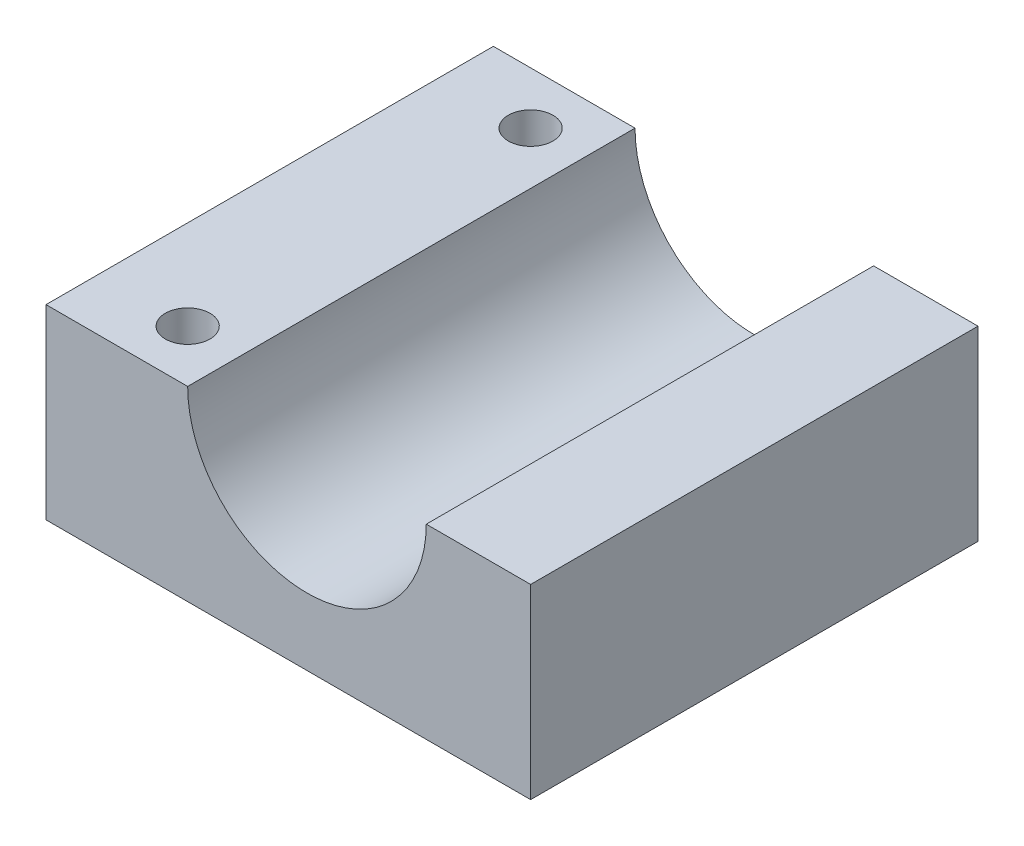
ISO-10303-21;
HEADER;
FILE_DESCRIPTION(('STEP AP214'),'2;1');
FILE_NAME('part.step','',(''),(''),'','','');
FILE_SCHEMA(('AUTOMOTIVE_DESIGN { 1 0 10303 214 1 1 1 1 }'));
ENDSEC;
DATA;
#1=APPLICATION_CONTEXT('core data for automotive mechanical design processes');
#2=APPLICATION_PROTOCOL_DEFINITION('international standard','automotive_design',2000,#1);
#3=PRODUCT_CONTEXT('',#1,'mechanical');
#4=PRODUCT('Part','Part','',(#3));
#5=PRODUCT_RELATED_PRODUCT_CATEGORY('part','',(#4));
#6=PRODUCT_DEFINITION_FORMATION('','',#4);
#7=PRODUCT_DEFINITION_CONTEXT('part definition',#1,'design');
#8=PRODUCT_DEFINITION('design','',#6,#7);
#9=PRODUCT_DEFINITION_SHAPE('','',#8);
#10=(LENGTH_UNIT() NAMED_UNIT(*) SI_UNIT(.MILLI.,.METRE.));
#11=(NAMED_UNIT(*) PLANE_ANGLE_UNIT() SI_UNIT($,.RADIAN.));
#12=(NAMED_UNIT(*) SI_UNIT($,.STERADIAN.) SOLID_ANGLE_UNIT());
#13=UNCERTAINTY_MEASURE_WITH_UNIT(LENGTH_MEASURE(1.E-05),#10,'distance_accuracy_value','');
#14=(GEOMETRIC_REPRESENTATION_CONTEXT(3) GLOBAL_UNCERTAINTY_ASSIGNED_CONTEXT((#13)) GLOBAL_UNIT_ASSIGNED_CONTEXT((#10,
#11,#12)) REPRESENTATION_CONTEXT('',''));
#15=CARTESIAN_POINT('',(0.,0.,0.));
#16=DIRECTION('',(0.,0.,1.));
#17=DIRECTION('',(1.,0.,0.));
#18=AXIS2_PLACEMENT_3D('',#15,#16,#17);
#19=CARTESIAN_POINT('',(-6.99257425742574,-8.81806930693069,30.));
#20=DIRECTION('',(0.,1.,0.));
#21=DIRECTION('',(0.,0.,1.));
#22=AXIS2_PLACEMENT_3D('',#19,#20,#21);
#23=PLANE('',#22);
#24=CARTESIAN_POINT('',(-3.49257425742574,-8.81806930693069,26.5));
#25=DIRECTION('',(0.,-1.,0.));
#26=DIRECTION('',(0.,0.,-1.));
#27=AXIS2_PLACEMENT_3D('',#24,#25,#26);
#28=CIRCLE('',#27,1.5);
#29=CARTESIAN_POINT('',(-3.49257425742574,-8.81806930693069,25.));
#30=VERTEX_POINT('',#29);
#31=EDGE_CURVE('E117',#30,#30,#28,.T.);
#32=ORIENTED_EDGE('',*,*,#31,.F.);
#33=EDGE_LOOP('',(#32));
#34=FACE_BOUND('',#33,.T.);
#35=CARTESIAN_POINT('',(-3.49257425742574,-8.81806930693069,3.5));
#36=DIRECTION('',(0.,-1.,0.));
#37=DIRECTION('',(0.,0.,-1.));
#38=AXIS2_PLACEMENT_3D('',#35,#36,#37);
#39=CIRCLE('',#38,1.5);
#40=CARTESIAN_POINT('',(-3.49257425742574,-8.81806930693069,2.));
#41=VERTEX_POINT('',#40);
#42=EDGE_CURVE('E121',#41,#41,#39,.T.);
#43=ORIENTED_EDGE('',*,*,#42,.F.);
#44=EDGE_LOOP('',(#43));
#45=FACE_BOUND('',#44,.T.);
#46=DIRECTION('',(1.,0.,0.));
#47=VECTOR('',#46,1.);
#48=CARTESIAN_POINT('',(-6.99257425742574,-8.81806930693069,0.));
#49=LINE('',#48,#47);
#50=CARTESIAN_POINT('',(-9.49257425742574,-8.81806930693069,0.));
#51=VERTEX_POINT('',#50);
#52=CARTESIAN_POINT('',(23.0074257425743,-8.81806930693069,0.));
#53=VERTEX_POINT('',#52);
#54=EDGE_CURVE('E93',#51,#53,#49,.T.);
#55=ORIENTED_EDGE('',*,*,#54,.T.);
#56=DIRECTION('',(0.,0.,-1.));
#57=VECTOR('',#56,1.);
#58=CARTESIAN_POINT('',(23.0074257425743,-8.81806930693069,30.));
#59=LINE('',#58,#57);
#60=CARTESIAN_POINT('',(23.0074257425743,-8.81806930693069,30.));
#61=VERTEX_POINT('',#60);
#62=EDGE_CURVE('E11',#61,#53,#59,.T.);
#63=ORIENTED_EDGE('',*,*,#62,.F.);
#64=DIRECTION('',(1.,0.,0.));
#65=VECTOR('',#64,1.);
#66=CARTESIAN_POINT('',(-6.99257425742574,-8.81806930693069,30.));
#67=LINE('',#66,#65);
#68=CARTESIAN_POINT('',(-9.49257425742574,-8.81806930693069,30.));
#69=VERTEX_POINT('',#68);
#70=EDGE_CURVE('E79',#69,#61,#67,.T.);
#71=ORIENTED_EDGE('',*,*,#70,.F.);
#72=DIRECTION('',(0.,0.,1.));
#73=VECTOR('',#72,1.);
#74=CARTESIAN_POINT('',(-9.49257425742574,-8.81806930693069,0.));
#75=LINE('',#74,#73);
#76=EDGE_CURVE('E104',#51,#69,#75,.T.);
#77=ORIENTED_EDGE('',*,*,#76,.F.);
#78=EDGE_LOOP('',(#55,#63,#71,#77));
#79=FACE_BOUND('',#78,.T.);
#80=ADVANCED_FACE('F32',(#34,#45,#79),#23,.F.);
#81=CARTESIAN_POINT('',(23.0074257425743,3.68193069306931,30.));
#82=DIRECTION('',(-1.,0.,0.));
#83=DIRECTION('',(0.,0.,1.));
#84=AXIS2_PLACEMENT_3D('',#81,#82,#83);
#85=PLANE('',#84);
#86=DIRECTION('',(0.,1.,0.));
#87=VECTOR('',#86,1.);
#88=CARTESIAN_POINT('',(23.0074257425743,3.68193069306931,0.));
#89=LINE('',#88,#87);
#90=CARTESIAN_POINT('',(23.0074257425743,3.68193069306931,0.));
#91=VERTEX_POINT('',#90);
#92=EDGE_CURVE('E99',#53,#91,#89,.T.);
#93=ORIENTED_EDGE('',*,*,#92,.T.);
#94=DIRECTION('',(0.,0.,-1.));
#95=VECTOR('',#94,1.);
#96=CARTESIAN_POINT('',(23.0074257425743,3.68193069306931,30.));
#97=LINE('',#96,#95);
#98=CARTESIAN_POINT('',(23.0074257425743,3.68193069306931,30.));
#99=VERTEX_POINT('',#98);
#100=EDGE_CURVE('E40',#99,#91,#97,.T.);
#101=ORIENTED_EDGE('',*,*,#100,.F.);
#102=DIRECTION('',(0.,1.,0.));
#103=VECTOR('',#102,1.);
#104=CARTESIAN_POINT('',(23.0074257425743,3.68193069306931,30.));
#105=LINE('',#104,#103);
#106=EDGE_CURVE('E129',#61,#99,#105,.T.);
#107=ORIENTED_EDGE('',*,*,#106,.F.);
#108=ORIENTED_EDGE('',*,*,#62,.T.);
#109=EDGE_LOOP('',(#93,#101,#107,#108));
#110=FACE_BOUND('',#109,.T.);
#111=ADVANCED_FACE('F162',(#110),#85,.F.);
#112=CARTESIAN_POINT('',(16.0074257425743,3.68193069306931,30.));
#113=DIRECTION('',(0.,-1.,0.));
#114=DIRECTION('',(0.,0.,-1.));
#115=AXIS2_PLACEMENT_3D('',#112,#113,#114);
#116=PLANE('',#115);
#117=DIRECTION('',(-1.,0.,0.));
#118=VECTOR('',#117,1.);
#119=CARTESIAN_POINT('',(16.0074257425743,3.68193069306931,0.));
#120=LINE('',#119,#118);
#121=CARTESIAN_POINT('',(16.0074257425743,3.68193069306931,0.));
#122=VERTEX_POINT('',#121);
#123=EDGE_CURVE('E66',#91,#122,#120,.T.);
#124=ORIENTED_EDGE('',*,*,#123,.T.);
#125=DIRECTION('',(0.,0.,-1.));
#126=VECTOR('',#125,1.);
#127=CARTESIAN_POINT('',(16.0074257425743,3.68193069306931,30.));
#128=LINE('',#127,#126);
#129=CARTESIAN_POINT('',(16.0074257425743,3.68193069306931,30.));
#130=VERTEX_POINT('',#129);
#131=EDGE_CURVE('E143',#130,#122,#128,.T.);
#132=ORIENTED_EDGE('',*,*,#131,.F.);
#133=DIRECTION('',(-1.,0.,0.));
#134=VECTOR('',#133,1.);
#135=CARTESIAN_POINT('',(16.0074257425743,3.68193069306931,30.));
#136=LINE('',#135,#134);
#137=EDGE_CURVE('E132',#99,#130,#136,.T.);
#138=ORIENTED_EDGE('',*,*,#137,.F.);
#139=ORIENTED_EDGE('',*,*,#100,.T.);
#140=EDGE_LOOP('',(#124,#132,#138,#139));
#141=FACE_BOUND('',#140,.T.);
#142=ADVANCED_FACE('F146',(#141),#116,.F.);
#143=CARTESIAN_POINT('',(8.00742574257426,3.68193069306931,30.));
#144=DIRECTION('',(0.,0.,-1.));
#145=DIRECTION('',(-1.,0.,0.));
#146=AXIS2_PLACEMENT_3D('',#143,#144,#145);
#147=CYLINDRICAL_SURFACE('',#146,8.);
#148=CARTESIAN_POINT('',(8.00742574257426,3.68193069306931,0.));
#149=DIRECTION('',(0.,0.,-1.));
#150=DIRECTION('',(1.,0.,0.));
#151=AXIS2_PLACEMENT_3D('',#148,#149,#150);
#152=CIRCLE('',#151,8.);
#153=CARTESIAN_POINT('',(0.0074257425742557,3.68193069306931,0.));
#154=VERTEX_POINT('',#153);
#155=EDGE_CURVE('E72',#122,#154,#152,.T.);
#156=ORIENTED_EDGE('',*,*,#155,.T.);
#157=DIRECTION('',(0.,0.,-1.));
#158=VECTOR('',#157,1.);
#159=CARTESIAN_POINT('',(0.0074257425742557,3.68193069306931,30.));
#160=LINE('',#159,#158);
#161=CARTESIAN_POINT('',(0.0074257425742557,3.68193069306931,30.));
#162=VERTEX_POINT('',#161);
#163=EDGE_CURVE('E136',#162,#154,#160,.T.);
#164=ORIENTED_EDGE('',*,*,#163,.F.);
#165=CARTESIAN_POINT('',(8.00742574257426,3.68193069306931,30.));
#166=DIRECTION('',(0.,0.,-1.));
#167=DIRECTION('',(1.,0.,0.));
#168=AXIS2_PLACEMENT_3D('',#165,#166,#167);
#169=CIRCLE('',#168,8.);
#170=EDGE_CURVE('E48',#130,#162,#169,.T.);
#171=ORIENTED_EDGE('',*,*,#170,.F.);
#172=ORIENTED_EDGE('',*,*,#131,.T.);
#173=EDGE_LOOP('',(#156,#164,#171,#172));
#174=FACE_BOUND('',#173,.T.);
#175=ADVANCED_FACE('F152',(#174),#147,.F.);
#176=CARTESIAN_POINT('',(-6.99257425742574,3.68193069306931,30.));
#177=DIRECTION('',(0.,-1.,0.));
#178=DIRECTION('',(0.,0.,-1.));
#179=AXIS2_PLACEMENT_3D('',#176,#177,#178);
#180=PLANE('',#179);
#181=CARTESIAN_POINT('',(-3.49257425742574,3.68193069306931,26.5));
#182=DIRECTION('',(0.,-1.,0.));
#183=DIRECTION('',(0.,0.,-1.));
#184=AXIS2_PLACEMENT_3D('',#181,#182,#183);
#185=CIRCLE('',#184,1.5);
#186=CARTESIAN_POINT('',(-3.49257425742574,3.68193069306931,25.));
#187=VERTEX_POINT('',#186);
#188=EDGE_CURVE('E118',#187,#187,#185,.T.);
#189=ORIENTED_EDGE('',*,*,#188,.T.);
#190=EDGE_LOOP('',(#189));
#191=FACE_BOUND('',#190,.T.);
#192=CARTESIAN_POINT('',(-3.49257425742574,3.68193069306931,3.5));
#193=DIRECTION('',(0.,-1.,0.));
#194=DIRECTION('',(0.,0.,-1.));
#195=AXIS2_PLACEMENT_3D('',#192,#193,#194);
#196=CIRCLE('',#195,1.5);
#197=CARTESIAN_POINT('',(-3.49257425742574,3.68193069306931,2.));
#198=VERTEX_POINT('',#197);
#199=EDGE_CURVE('E101',#198,#198,#196,.T.);
#200=ORIENTED_EDGE('',*,*,#199,.T.);
#201=EDGE_LOOP('',(#200));
#202=FACE_BOUND('',#201,.T.);
#203=DIRECTION('',(-1.,0.,0.));
#204=VECTOR('',#203,1.);
#205=CARTESIAN_POINT('',(-6.99257425742574,3.68193069306931,0.));
#206=LINE('',#205,#204);
#207=CARTESIAN_POINT('',(-9.49257425742574,3.68193069306931,0.));
#208=VERTEX_POINT('',#207);
#209=EDGE_CURVE('E130',#154,#208,#206,.T.);
#210=ORIENTED_EDGE('',*,*,#209,.T.);
#211=DIRECTION('',(0.,0.,-1.));
#212=VECTOR('',#211,1.);
#213=CARTESIAN_POINT('',(-9.49257425742574,3.68193069306931,0.));
#214=LINE('',#213,#212);
#215=CARTESIAN_POINT('',(-9.49257425742574,3.68193069306931,30.));
#216=VERTEX_POINT('',#215);
#217=EDGE_CURVE('E112',#216,#208,#214,.T.);
#218=ORIENTED_EDGE('',*,*,#217,.F.);
#219=DIRECTION('',(-1.,0.,0.));
#220=VECTOR('',#219,1.);
#221=CARTESIAN_POINT('',(-6.99257425742574,3.68193069306931,30.));
#222=LINE('',#221,#220);
#223=EDGE_CURVE('E135',#162,#216,#222,.T.);
#224=ORIENTED_EDGE('',*,*,#223,.F.);
#225=ORIENTED_EDGE('',*,*,#163,.T.);
#226=EDGE_LOOP('',(#210,#218,#224,#225));
#227=FACE_BOUND('',#226,.T.);
#228=ADVANCED_FACE('F150',(#191,#202,#227),#180,.F.);
#229=CARTESIAN_POINT('',(8.00742574257426,3.68193069306931,30.));
#230=DIRECTION('',(0.,0.,1.));
#231=DIRECTION('',(1.,0.,0.));
#232=AXIS2_PLACEMENT_3D('',#229,#230,#231);
#233=PLANE('',#232);
#234=ORIENTED_EDGE('',*,*,#223,.T.);
#235=DIRECTION('',(0.,1.,0.));
#236=VECTOR('',#235,1.);
#237=CARTESIAN_POINT('',(-9.49257425742574,3.68193069306931,30.));
#238=LINE('',#237,#236);
#239=EDGE_CURVE('E107',#69,#216,#238,.T.);
#240=ORIENTED_EDGE('',*,*,#239,.F.);
#241=ORIENTED_EDGE('',*,*,#70,.T.);
#242=ORIENTED_EDGE('',*,*,#106,.T.);
#243=ORIENTED_EDGE('',*,*,#137,.T.);
#244=ORIENTED_EDGE('',*,*,#170,.T.);
#245=EDGE_LOOP('',(#234,#240,#241,#242,#243,#244));
#246=FACE_BOUND('',#245,.T.);
#247=ADVANCED_FACE('F159',(#246),#233,.T.);
#248=CARTESIAN_POINT('',(8.00742574257426,3.68193069306931,0.));
#249=DIRECTION('',(0.,0.,1.));
#250=DIRECTION('',(1.,0.,0.));
#251=AXIS2_PLACEMENT_3D('',#248,#249,#250);
#252=PLANE('',#251);
#253=ORIENTED_EDGE('',*,*,#54,.F.);
#254=DIRECTION('',(0.,-1.,0.));
#255=VECTOR('',#254,1.);
#256=CARTESIAN_POINT('',(-9.49257425742574,3.68193069306931,0.));
#257=LINE('',#256,#255);
#258=EDGE_CURVE('E98',#208,#51,#257,.T.);
#259=ORIENTED_EDGE('',*,*,#258,.F.);
#260=ORIENTED_EDGE('',*,*,#209,.F.);
#261=ORIENTED_EDGE('',*,*,#155,.F.);
#262=ORIENTED_EDGE('',*,*,#123,.F.);
#263=ORIENTED_EDGE('',*,*,#92,.F.);
#264=EDGE_LOOP('',(#253,#259,#260,#261,#262,#263));
#265=FACE_BOUND('',#264,.T.);
#266=ADVANCED_FACE('F95',(#265),#252,.F.);
#267=CARTESIAN_POINT('',(-3.49257425742574,3.68193069306931,3.5));
#268=DIRECTION('',(0.,-1.,0.));
#269=DIRECTION('',(0.,0.,-1.));
#270=AXIS2_PLACEMENT_3D('',#267,#268,#269);
#271=CYLINDRICAL_SURFACE('',#270,1.5);
#272=ORIENTED_EDGE('',*,*,#199,.F.);
#273=EDGE_LOOP('',(#272));
#274=FACE_BOUND('',#273,.T.);
#275=ORIENTED_EDGE('',*,*,#42,.T.);
#276=EDGE_LOOP('',(#275));
#277=FACE_BOUND('',#276,.T.);
#278=ADVANCED_FACE('F173',(#274,#277),#271,.F.);
#279=CARTESIAN_POINT('',(-3.49257425742574,3.68193069306931,26.5));
#280=DIRECTION('',(0.,-1.,0.));
#281=DIRECTION('',(0.,0.,-1.));
#282=AXIS2_PLACEMENT_3D('',#279,#280,#281);
#283=CYLINDRICAL_SURFACE('',#282,1.5);
#284=ORIENTED_EDGE('',*,*,#188,.F.);
#285=EDGE_LOOP('',(#284));
#286=FACE_BOUND('',#285,.T.);
#287=ORIENTED_EDGE('',*,*,#31,.T.);
#288=EDGE_LOOP('',(#287));
#289=FACE_BOUND('',#288,.T.);
#290=ADVANCED_FACE('F175',(#286,#289),#283,.F.);
#291=CARTESIAN_POINT('',(-9.49257425742574,0.,0.));
#292=DIRECTION('',(-1.,0.,0.));
#293=DIRECTION('',(0.,0.,1.));
#294=AXIS2_PLACEMENT_3D('',#291,#292,#293);
#295=PLANE('',#294);
#296=ORIENTED_EDGE('',*,*,#258,.T.);
#297=ORIENTED_EDGE('',*,*,#76,.T.);
#298=ORIENTED_EDGE('',*,*,#239,.T.);
#299=ORIENTED_EDGE('',*,*,#217,.T.);
#300=EDGE_LOOP('',(#296,#297,#298,#299));
#301=FACE_BOUND('',#300,.T.);
#302=ADVANCED_FACE('F110',(#301),#295,.T.);
#303=CLOSED_SHELL('',(#80,#111,#142,#175,#228,#247,#266,#278,#290,#302));
#304=MANIFOLD_SOLID_BREP('B2',#303);
#305=ADVANCED_BREP_SHAPE_REPRESENTATION('',(#18,#304),#14);
#306=SHAPE_DEFINITION_REPRESENTATION(#9,#305);
ENDSEC;
END-ISO-10303-21;
